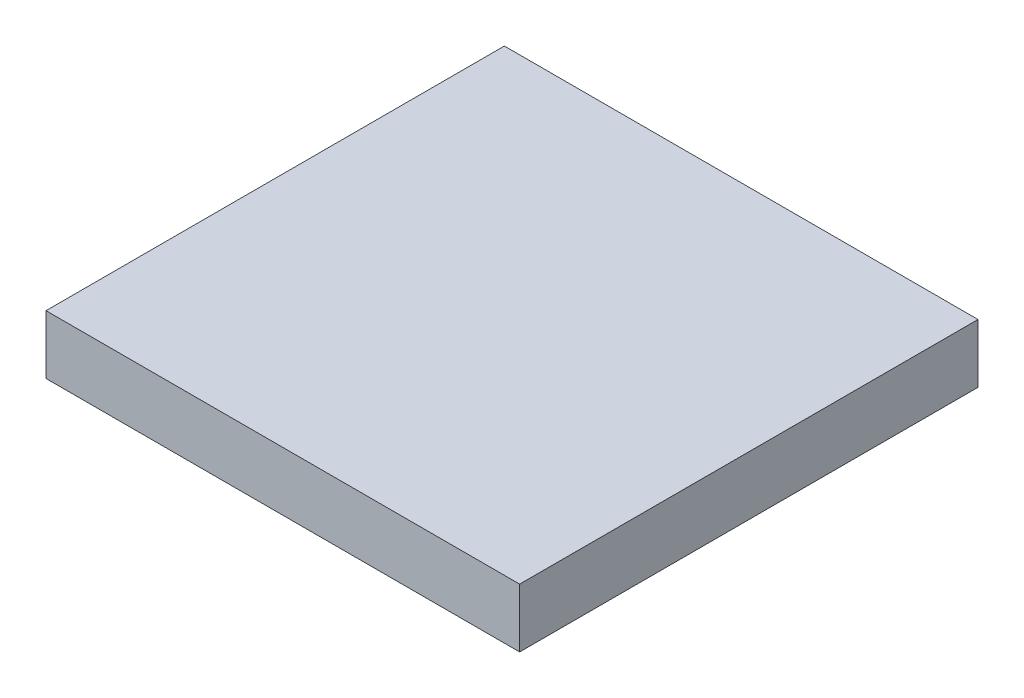
ISO-10303-21;
HEADER;
FILE_DESCRIPTION(('STEP AP214'),'2;1');
FILE_NAME('part.step','',(''),(''),'','','');
FILE_SCHEMA(('AUTOMOTIVE_DESIGN { 1 0 10303 214 1 1 1 1 }'));
ENDSEC;
DATA;
#1=APPLICATION_CONTEXT('core data for automotive mechanical design processes');
#2=APPLICATION_PROTOCOL_DEFINITION('international standard','automotive_design',2000,#1);
#3=PRODUCT_CONTEXT('',#1,'mechanical');
#4=PRODUCT('Part','Part','',(#3));
#5=PRODUCT_RELATED_PRODUCT_CATEGORY('part','',(#4));
#6=PRODUCT_DEFINITION_FORMATION('','',#4);
#7=PRODUCT_DEFINITION_CONTEXT('part definition',#1,'design');
#8=PRODUCT_DEFINITION('design','',#6,#7);
#9=PRODUCT_DEFINITION_SHAPE('','',#8);
#10=(LENGTH_UNIT() NAMED_UNIT(*) SI_UNIT(.MILLI.,.METRE.));
#11=(NAMED_UNIT(*) PLANE_ANGLE_UNIT() SI_UNIT($,.RADIAN.));
#12=(NAMED_UNIT(*) SI_UNIT($,.STERADIAN.) SOLID_ANGLE_UNIT());
#13=UNCERTAINTY_MEASURE_WITH_UNIT(LENGTH_MEASURE(1.E-05),#10,'distance_accuracy_value','');
#14=(GEOMETRIC_REPRESENTATION_CONTEXT(3) GLOBAL_UNCERTAINTY_ASSIGNED_CONTEXT((#13)) GLOBAL_UNIT_ASSIGNED_CONTEXT((#10,
#11,#12)) REPRESENTATION_CONTEXT('',''));
#15=CARTESIAN_POINT('',(0.,0.,0.));
#16=DIRECTION('',(0.,0.,1.));
#17=DIRECTION('',(1.,0.,0.));
#18=AXIS2_PLACEMENT_3D('',#15,#16,#17);
#19=CARTESIAN_POINT('',(0.,15.55,0.));
#20=DIRECTION('',(0.,1.,0.));
#21=DIRECTION('',(0.,0.,1.));
#22=AXIS2_PLACEMENT_3D('',#19,#20,#21);
#23=PLANE('',#22);
#24=DIRECTION('',(0.,0.,-1.));
#25=VECTOR('',#24,1.);
#26=CARTESIAN_POINT('',(-40.3,15.55,45.5));
#27=LINE('',#26,#25);
#28=CARTESIAN_POINT('',(-40.3,15.55,-32.5));
#29=VERTEX_POINT('',#28);
#30=CARTESIAN_POINT('',(-40.3,15.55,45.5));
#31=VERTEX_POINT('',#30);
#32=EDGE_CURVE('E55',#29,#31,#27,.F.);
#33=ORIENTED_EDGE('',*,*,#32,.T.);
#34=DIRECTION('',(-1.,0.,0.));
#35=VECTOR('',#34,1.);
#36=CARTESIAN_POINT('',(40.3,15.55,45.5));
#37=LINE('',#36,#35);
#38=CARTESIAN_POINT('',(40.3,15.55,45.5));
#39=VERTEX_POINT('',#38);
#40=EDGE_CURVE('E82',#31,#39,#37,.F.);
#41=ORIENTED_EDGE('',*,*,#40,.T.);
#42=DIRECTION('',(0.,0.,-1.));
#43=VECTOR('',#42,1.);
#44=CARTESIAN_POINT('',(40.3,15.55,45.5));
#45=LINE('',#44,#43);
#46=CARTESIAN_POINT('',(40.3,15.55,-32.5));
#47=VERTEX_POINT('',#46);
#48=EDGE_CURVE('E60',#47,#39,#45,.F.);
#49=ORIENTED_EDGE('',*,*,#48,.F.);
#50=DIRECTION('',(-1.,0.,0.));
#51=VECTOR('',#50,1.);
#52=CARTESIAN_POINT('',(40.3,15.55,-32.5));
#53=LINE('',#52,#51);
#54=EDGE_CURVE('E20',#29,#47,#53,.F.);
#55=ORIENTED_EDGE('',*,*,#54,.F.);
#56=EDGE_LOOP('',(#33,#41,#49,#55));
#57=FACE_BOUND('',#56,.T.);
#58=ADVANCED_FACE('F17',(#57),#23,.T.);
#59=CARTESIAN_POINT('',(40.3,5.55,-32.5));
#60=DIRECTION('',(0.,0.,-1.));
#61=DIRECTION('',(-1.,0.,0.));
#62=AXIS2_PLACEMENT_3D('',#59,#60,#61);
#63=PLANE('',#62);
#64=DIRECTION('',(1.,0.,0.));
#65=VECTOR('',#64,1.);
#66=CARTESIAN_POINT('',(0.,5.55,-32.5));
#67=LINE('',#66,#65);
#68=CARTESIAN_POINT('',(40.3,5.55,-32.5));
#69=VERTEX_POINT('',#68);
#70=CARTESIAN_POINT('',(-40.3,5.55,-32.5));
#71=VERTEX_POINT('',#70);
#72=EDGE_CURVE('E77',#69,#71,#67,.F.);
#73=ORIENTED_EDGE('',*,*,#72,.T.);
#74=DIRECTION('',(0.,1.,0.));
#75=VECTOR('',#74,1.);
#76=CARTESIAN_POINT('',(-40.3,5.55,-32.5));
#77=LINE('',#76,#75);
#78=EDGE_CURVE('E66',#71,#29,#77,.T.);
#79=ORIENTED_EDGE('',*,*,#78,.T.);
#80=ORIENTED_EDGE('',*,*,#54,.T.);
#81=DIRECTION('',(0.,1.,0.));
#82=VECTOR('',#81,1.);
#83=CARTESIAN_POINT('',(40.3,5.55,-32.5));
#84=LINE('',#83,#82);
#85=EDGE_CURVE('E87',#69,#47,#84,.T.);
#86=ORIENTED_EDGE('',*,*,#85,.F.);
#87=EDGE_LOOP('',(#73,#79,#80,#86));
#88=FACE_BOUND('',#87,.T.);
#89=ADVANCED_FACE('F76',(#88),#63,.T.);
#90=CARTESIAN_POINT('',(-40.3,5.55,45.5));
#91=DIRECTION('',(1.,0.,0.));
#92=DIRECTION('',(0.,0.,-1.));
#93=AXIS2_PLACEMENT_3D('',#90,#91,#92);
#94=PLANE('',#93);
#95=ORIENTED_EDGE('',*,*,#78,.F.);
#96=DIRECTION('',(0.,0.,1.));
#97=VECTOR('',#96,1.);
#98=CARTESIAN_POINT('',(-40.3,5.55,0.));
#99=LINE('',#98,#97);
#100=CARTESIAN_POINT('',(-40.3,5.55,45.5));
#101=VERTEX_POINT('',#100);
#102=EDGE_CURVE('E90',#71,#101,#99,.T.);
#103=ORIENTED_EDGE('',*,*,#102,.T.);
#104=DIRECTION('',(0.,1.,0.));
#105=VECTOR('',#104,1.);
#106=CARTESIAN_POINT('',(-40.3,5.55,45.5));
#107=LINE('',#106,#105);
#108=EDGE_CURVE('E72',#101,#31,#107,.T.);
#109=ORIENTED_EDGE('',*,*,#108,.T.);
#110=ORIENTED_EDGE('',*,*,#32,.F.);
#111=EDGE_LOOP('',(#95,#103,#109,#110));
#112=FACE_BOUND('',#111,.T.);
#113=ADVANCED_FACE('F69',(#112),#94,.F.);
#114=CARTESIAN_POINT('',(40.3,5.55,45.5));
#115=DIRECTION('',(0.,0.,-1.));
#116=DIRECTION('',(-1.,0.,0.));
#117=AXIS2_PLACEMENT_3D('',#114,#115,#116);
#118=PLANE('',#117);
#119=ORIENTED_EDGE('',*,*,#108,.F.);
#120=DIRECTION('',(1.,0.,0.));
#121=VECTOR('',#120,1.);
#122=CARTESIAN_POINT('',(0.,5.55,45.5));
#123=LINE('',#122,#121);
#124=CARTESIAN_POINT('',(40.3,5.55,45.5));
#125=VERTEX_POINT('',#124);
#126=EDGE_CURVE('E26',#101,#125,#123,.T.);
#127=ORIENTED_EDGE('',*,*,#126,.T.);
#128=DIRECTION('',(0.,1.,0.));
#129=VECTOR('',#128,1.);
#130=CARTESIAN_POINT('',(40.3,5.55,45.5));
#131=LINE('',#130,#129);
#132=EDGE_CURVE('E34',#39,#125,#131,.F.);
#133=ORIENTED_EDGE('',*,*,#132,.F.);
#134=ORIENTED_EDGE('',*,*,#40,.F.);
#135=EDGE_LOOP('',(#119,#127,#133,#134));
#136=FACE_BOUND('',#135,.T.);
#137=ADVANCED_FACE('F96',(#136),#118,.F.);
#138=CARTESIAN_POINT('',(40.3,5.55,45.5));
#139=DIRECTION('',(1.,0.,0.));
#140=DIRECTION('',(0.,0.,-1.));
#141=AXIS2_PLACEMENT_3D('',#138,#139,#140);
#142=PLANE('',#141);
#143=DIRECTION('',(0.,0.,1.));
#144=VECTOR('',#143,1.);
#145=CARTESIAN_POINT('',(40.3,5.55,0.));
#146=LINE('',#145,#144);
#147=EDGE_CURVE('E11',#125,#69,#146,.F.);
#148=ORIENTED_EDGE('',*,*,#147,.T.);
#149=ORIENTED_EDGE('',*,*,#85,.T.);
#150=ORIENTED_EDGE('',*,*,#48,.T.);
#151=ORIENTED_EDGE('',*,*,#132,.T.);
#152=EDGE_LOOP('',(#148,#149,#150,#151));
#153=FACE_BOUND('',#152,.T.);
#154=ADVANCED_FACE('F99',(#153),#142,.T.);
#155=CARTESIAN_POINT('',(0.,5.55,0.));
#156=DIRECTION('',(0.,1.,0.));
#157=DIRECTION('',(0.,0.,1.));
#158=AXIS2_PLACEMENT_3D('',#155,#156,#157);
#159=PLANE('',#158);
#160=ORIENTED_EDGE('',*,*,#126,.F.);
#161=ORIENTED_EDGE('',*,*,#102,.F.);
#162=ORIENTED_EDGE('',*,*,#72,.F.);
#163=ORIENTED_EDGE('',*,*,#147,.F.);
#164=EDGE_LOOP('',(#160,#161,#162,#163));
#165=FACE_BOUND('',#164,.T.);
#166=ADVANCED_FACE('F98',(#165),#159,.F.);
#167=CLOSED_SHELL('',(#58,#89,#113,#137,#154,#166));
#168=MANIFOLD_SOLID_BREP('B1',#167);
#169=ADVANCED_BREP_SHAPE_REPRESENTATION('',(#18,#168),#14);
#170=SHAPE_DEFINITION_REPRESENTATION(#9,#169);
ENDSEC;
END-ISO-10303-21;
